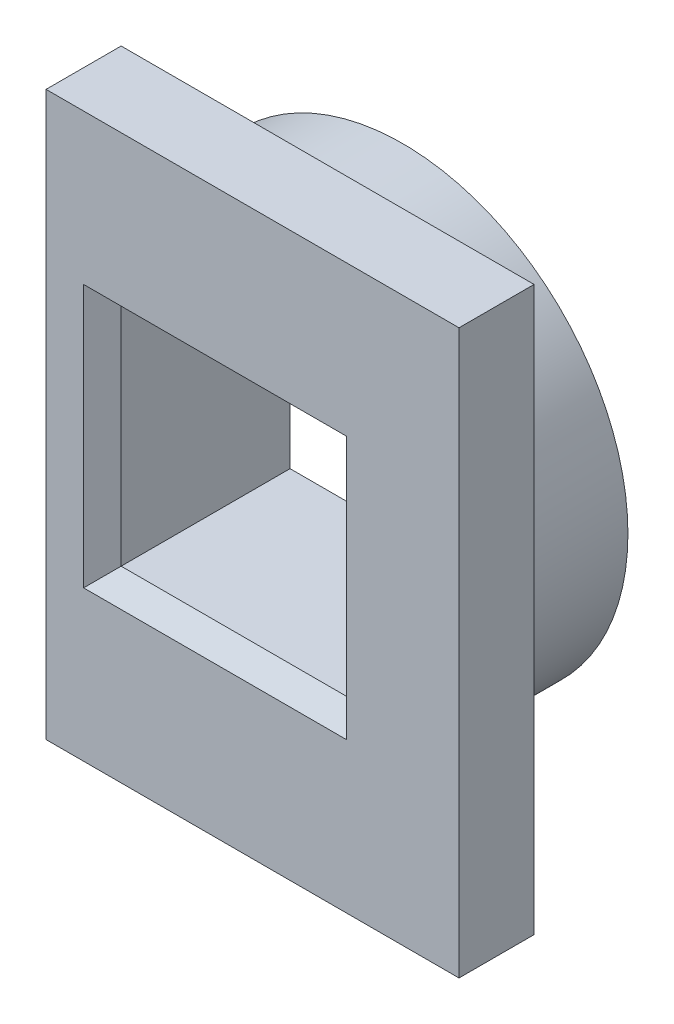
ISO-10303-21;
HEADER;
FILE_DESCRIPTION(('STEP AP214'),'2;1');
FILE_NAME('part.step','',(''),(''),'','','');
FILE_SCHEMA(('AUTOMOTIVE_DESIGN { 1 0 10303 214 1 1 1 1 }'));
ENDSEC;
DATA;
#1=APPLICATION_CONTEXT('core data for automotive mechanical design processes');
#2=APPLICATION_PROTOCOL_DEFINITION('international standard','automotive_design',2000,#1);
#3=PRODUCT_CONTEXT('',#1,'mechanical');
#4=PRODUCT('Part','Part','',(#3));
#5=PRODUCT_RELATED_PRODUCT_CATEGORY('part','',(#4));
#6=PRODUCT_DEFINITION_FORMATION('','',#4);
#7=PRODUCT_DEFINITION_CONTEXT('part definition',#1,'design');
#8=PRODUCT_DEFINITION('design','',#6,#7);
#9=PRODUCT_DEFINITION_SHAPE('','',#8);
#10=(LENGTH_UNIT() NAMED_UNIT(*) SI_UNIT(.MILLI.,.METRE.));
#11=(NAMED_UNIT(*) PLANE_ANGLE_UNIT() SI_UNIT($,.RADIAN.));
#12=(NAMED_UNIT(*) SI_UNIT($,.STERADIAN.) SOLID_ANGLE_UNIT());
#13=UNCERTAINTY_MEASURE_WITH_UNIT(LENGTH_MEASURE(1.E-05),#10,'distance_accuracy_value','');
#14=(GEOMETRIC_REPRESENTATION_CONTEXT(3) GLOBAL_UNCERTAINTY_ASSIGNED_CONTEXT((#13)) GLOBAL_UNIT_ASSIGNED_CONTEXT((#10,
#11,#12)) REPRESENTATION_CONTEXT('',''));
#15=CARTESIAN_POINT('',(0.,0.,0.));
#16=DIRECTION('',(0.,0.,1.));
#17=DIRECTION('',(1.,0.,0.));
#18=AXIS2_PLACEMENT_3D('',#15,#16,#17);
#19=CARTESIAN_POINT('',(0.,0.,3.));
#20=DIRECTION('',(0.,0.,-1.));
#21=DIRECTION('',(-1.,0.,0.));
#22=AXIS2_PLACEMENT_3D('',#19,#20,#21);
#23=CYLINDRICAL_SURFACE('',#22,6.);
#24=CARTESIAN_POINT('',(0.,0.,3.));
#25=DIRECTION('',(0.,0.,1.));
#26=DIRECTION('',(1.,0.,0.));
#27=AXIS2_PLACEMENT_3D('',#24,#25,#26);
#28=CIRCLE('',#27,6.);
#29=CARTESIAN_POINT('',(-4.5,3.96862696659689,3.));
#30=VERTEX_POINT('',#29);
#31=CARTESIAN_POINT('',(-4.5,-3.96862696659689,3.));
#32=VERTEX_POINT('',#31);
#33=EDGE_CURVE('E205',#30,#32,#28,.T.);
#34=ORIENTED_EDGE('',*,*,#33,.F.);
#35=EDGE_CURVE('E208',#32,#30,#28,.T.);
#36=ORIENTED_EDGE('',*,*,#35,.F.);
#37=EDGE_LOOP('',(#34,#36));
#38=FACE_BOUND('',#37,.T.);
#39=CARTESIAN_POINT('',(0.,0.,0.));
#40=DIRECTION('',(0.,0.,1.));
#41=DIRECTION('',(1.,0.,0.));
#42=AXIS2_PLACEMENT_3D('',#39,#40,#41);
#43=CIRCLE('',#42,6.);
#44=CARTESIAN_POINT('',(6.,0.,0.));
#45=VERTEX_POINT('',#44);
#46=EDGE_CURVE('E204',#45,#45,#43,.T.);
#47=ORIENTED_EDGE('',*,*,#46,.T.);
#48=EDGE_LOOP('',(#47));
#49=FACE_BOUND('',#48,.T.);
#50=ADVANCED_FACE('F41',(#38,#49),#23,.T.);
#51=CARTESIAN_POINT('',(0.,0.,3.));
#52=DIRECTION('',(0.,0.,1.));
#53=DIRECTION('',(1.,0.,0.));
#54=AXIS2_PLACEMENT_3D('',#51,#52,#53);
#55=PLANE('',#54);
#56=DIRECTION('',(0.,-1.,0.));
#57=VECTOR('',#56,1.);
#58=CARTESIAN_POINT('',(-4.5,7.5,3.));
#59=LINE('',#58,#57);
#60=EDGE_CURVE('E181',#30,#32,#59,.T.);
#61=ORIENTED_EDGE('',*,*,#60,.F.);
#62=ORIENTED_EDGE('',*,*,#33,.T.);
#63=EDGE_LOOP('',(#61,#62));
#64=FACE_BOUND('',#63,.T.);
#65=ADVANCED_FACE('F278',(#64),#55,.T.);
#66=CARTESIAN_POINT('',(0.,0.,0.));
#67=DIRECTION('',(0.,0.,1.));
#68=DIRECTION('',(1.,0.,0.));
#69=AXIS2_PLACEMENT_3D('',#66,#67,#68);
#70=PLANE('',#69);
#71=DIRECTION('',(-1.,0.,0.));
#72=VECTOR('',#71,1.);
#73=CARTESIAN_POINT('',(3.,-3.,0.));
#74=LINE('',#73,#72);
#75=CARTESIAN_POINT('',(3.,-3.,0.));
#76=VERTEX_POINT('',#75);
#77=CARTESIAN_POINT('',(-3.,-3.,0.));
#78=VERTEX_POINT('',#77);
#79=EDGE_CURVE('E135',#76,#78,#74,.T.);
#80=ORIENTED_EDGE('',*,*,#79,.F.);
#81=DIRECTION('',(0.,-1.,0.));
#82=VECTOR('',#81,1.);
#83=CARTESIAN_POINT('',(3.,3.,0.));
#84=LINE('',#83,#82);
#85=CARTESIAN_POINT('',(3.,3.,0.));
#86=VERTEX_POINT('',#85);
#87=EDGE_CURVE('E141',#86,#76,#84,.T.);
#88=ORIENTED_EDGE('',*,*,#87,.F.);
#89=DIRECTION('',(1.,0.,0.));
#90=VECTOR('',#89,1.);
#91=CARTESIAN_POINT('',(3.,3.,0.));
#92=LINE('',#91,#90);
#93=CARTESIAN_POINT('',(-3.,3.,0.));
#94=VERTEX_POINT('',#93);
#95=EDGE_CURVE('E146',#94,#86,#92,.T.);
#96=ORIENTED_EDGE('',*,*,#95,.F.);
#97=DIRECTION('',(0.,1.,0.));
#98=VECTOR('',#97,1.);
#99=CARTESIAN_POINT('',(-3.,3.,0.));
#100=LINE('',#99,#98);
#101=EDGE_CURVE('E128',#78,#94,#100,.T.);
#102=ORIENTED_EDGE('',*,*,#101,.F.);
#103=EDGE_LOOP('',(#80,#88,#96,#102));
#104=FACE_BOUND('',#103,.T.);
#105=ORIENTED_EDGE('',*,*,#46,.F.);
#106=EDGE_LOOP('',(#105));
#107=FACE_BOUND('',#106,.T.);
#108=ADVANCED_FACE('F143',(#104,#107),#70,.F.);
#109=CARTESIAN_POINT('',(0.,0.,3.));
#110=DIRECTION('',(0.,0.,1.));
#111=DIRECTION('',(1.,0.,0.));
#112=AXIS2_PLACEMENT_3D('',#109,#110,#111);
#113=PLANE('',#112);
#114=CARTESIAN_POINT('',(-4.5,-7.5,3.));
#115=VERTEX_POINT('',#114);
#116=EDGE_CURVE('E156',#32,#115,#59,.T.);
#117=ORIENTED_EDGE('',*,*,#116,.F.);
#118=ORIENTED_EDGE('',*,*,#35,.T.);
#119=CARTESIAN_POINT('',(-4.5,7.5,3.));
#120=VERTEX_POINT('',#119);
#121=EDGE_CURVE('E176',#120,#30,#59,.T.);
#122=ORIENTED_EDGE('',*,*,#121,.F.);
#123=DIRECTION('',(-1.,0.,0.));
#124=VECTOR('',#123,1.);
#125=CARTESIAN_POINT('',(-4.5,7.5,3.));
#126=LINE('',#125,#124);
#127=CARTESIAN_POINT('',(6.5,7.5,3.));
#128=VERTEX_POINT('',#127);
#129=EDGE_CURVE('E166',#128,#120,#126,.T.);
#130=ORIENTED_EDGE('',*,*,#129,.F.);
#131=DIRECTION('',(0.,1.,0.));
#132=VECTOR('',#131,1.);
#133=CARTESIAN_POINT('',(6.5,7.5,3.));
#134=LINE('',#133,#132);
#135=CARTESIAN_POINT('',(6.5,-7.5,3.));
#136=VERTEX_POINT('',#135);
#137=EDGE_CURVE('E184',#136,#128,#134,.T.);
#138=ORIENTED_EDGE('',*,*,#137,.F.);
#139=DIRECTION('',(1.,0.,0.));
#140=VECTOR('',#139,1.);
#141=CARTESIAN_POINT('',(-4.5,-7.5,3.));
#142=LINE('',#141,#140);
#143=EDGE_CURVE('E180',#115,#136,#142,.T.);
#144=ORIENTED_EDGE('',*,*,#143,.F.);
#145=EDGE_LOOP('',(#117,#118,#122,#130,#138,#144));
#146=FACE_BOUND('',#145,.T.);
#147=ADVANCED_FACE('F369',(#146),#113,.F.);
#148=CARTESIAN_POINT('',(-4.5,7.5,5.));
#149=DIRECTION('',(1.,0.,0.));
#150=DIRECTION('',(0.,1.,0.));
#151=AXIS2_PLACEMENT_3D('',#148,#149,#150);
#152=PLANE('',#151);
#153=ORIENTED_EDGE('',*,*,#121,.T.);
#154=ORIENTED_EDGE('',*,*,#60,.T.);
#155=ORIENTED_EDGE('',*,*,#116,.T.);
#156=DIRECTION('',(0.,0.,-1.));
#157=VECTOR('',#156,1.);
#158=CARTESIAN_POINT('',(-4.5,-7.5,5.));
#159=LINE('',#158,#157);
#160=CARTESIAN_POINT('',(-4.5,-7.5,5.));
#161=VERTEX_POINT('',#160);
#162=EDGE_CURVE('E200',#161,#115,#159,.T.);
#163=ORIENTED_EDGE('',*,*,#162,.F.);
#164=DIRECTION('',(0.,-1.,0.));
#165=VECTOR('',#164,1.);
#166=CARTESIAN_POINT('',(-4.5,7.5,5.));
#167=LINE('',#166,#165);
#168=CARTESIAN_POINT('',(-4.5,7.5,5.));
#169=VERTEX_POINT('',#168);
#170=EDGE_CURVE('E161',#169,#161,#167,.T.);
#171=ORIENTED_EDGE('',*,*,#170,.F.);
#172=DIRECTION('',(0.,0.,-1.));
#173=VECTOR('',#172,1.);
#174=CARTESIAN_POINT('',(-4.5,7.5,5.));
#175=LINE('',#174,#173);
#176=EDGE_CURVE('E175',#169,#120,#175,.T.);
#177=ORIENTED_EDGE('',*,*,#176,.T.);
#178=EDGE_LOOP('',(#153,#154,#155,#163,#171,#177));
#179=FACE_BOUND('',#178,.T.);
#180=ADVANCED_FACE('F398',(#179),#152,.F.);
#181=CARTESIAN_POINT('',(-4.5,-7.5,5.));
#182=DIRECTION('',(0.,1.,0.));
#183=DIRECTION('',(0.,0.,1.));
#184=AXIS2_PLACEMENT_3D('',#181,#182,#183);
#185=PLANE('',#184);
#186=ORIENTED_EDGE('',*,*,#143,.T.);
#187=DIRECTION('',(0.,0.,-1.));
#188=VECTOR('',#187,1.);
#189=CARTESIAN_POINT('',(6.5,-7.5,5.));
#190=LINE('',#189,#188);
#191=CARTESIAN_POINT('',(6.5,-7.5,5.));
#192=VERTEX_POINT('',#191);
#193=EDGE_CURVE('E196',#192,#136,#190,.T.);
#194=ORIENTED_EDGE('',*,*,#193,.F.);
#195=DIRECTION('',(1.,0.,0.));
#196=VECTOR('',#195,1.);
#197=CARTESIAN_POINT('',(-4.5,-7.5,5.));
#198=LINE('',#197,#196);
#199=EDGE_CURVE('E165',#161,#192,#198,.T.);
#200=ORIENTED_EDGE('',*,*,#199,.F.);
#201=ORIENTED_EDGE('',*,*,#162,.T.);
#202=EDGE_LOOP('',(#186,#194,#200,#201));
#203=FACE_BOUND('',#202,.T.);
#204=ADVANCED_FACE('F388',(#203),#185,.F.);
#205=CARTESIAN_POINT('',(6.5,7.5,5.));
#206=DIRECTION('',(-1.,0.,0.));
#207=DIRECTION('',(0.,0.,1.));
#208=AXIS2_PLACEMENT_3D('',#205,#206,#207);
#209=PLANE('',#208);
#210=ORIENTED_EDGE('',*,*,#137,.T.);
#211=DIRECTION('',(0.,0.,-1.));
#212=VECTOR('',#211,1.);
#213=CARTESIAN_POINT('',(6.5,7.5,5.));
#214=LINE('',#213,#212);
#215=CARTESIAN_POINT('',(6.5,7.5,5.));
#216=VERTEX_POINT('',#215);
#217=EDGE_CURVE('E192',#216,#128,#214,.T.);
#218=ORIENTED_EDGE('',*,*,#217,.F.);
#219=DIRECTION('',(0.,1.,0.));
#220=VECTOR('',#219,1.);
#221=CARTESIAN_POINT('',(6.5,7.5,5.));
#222=LINE('',#221,#220);
#223=EDGE_CURVE('E169',#192,#216,#222,.T.);
#224=ORIENTED_EDGE('',*,*,#223,.F.);
#225=ORIENTED_EDGE('',*,*,#193,.T.);
#226=EDGE_LOOP('',(#210,#218,#224,#225));
#227=FACE_BOUND('',#226,.T.);
#228=ADVANCED_FACE('F378',(#227),#209,.F.);
#229=CARTESIAN_POINT('',(-4.5,7.5,5.));
#230=DIRECTION('',(0.,-1.,0.));
#231=DIRECTION('',(1.,0.,0.));
#232=AXIS2_PLACEMENT_3D('',#229,#230,#231);
#233=PLANE('',#232);
#234=ORIENTED_EDGE('',*,*,#129,.T.);
#235=ORIENTED_EDGE('',*,*,#176,.F.);
#236=DIRECTION('',(-1.,0.,0.));
#237=VECTOR('',#236,1.);
#238=CARTESIAN_POINT('',(-4.5,7.5,5.));
#239=LINE('',#238,#237);
#240=EDGE_CURVE('E172',#216,#169,#239,.T.);
#241=ORIENTED_EDGE('',*,*,#240,.F.);
#242=ORIENTED_EDGE('',*,*,#217,.T.);
#243=EDGE_LOOP('',(#234,#235,#241,#242));
#244=FACE_BOUND('',#243,.T.);
#245=ADVANCED_FACE('F358',(#244),#233,.F.);
#246=CARTESIAN_POINT('',(0.,0.,5.));
#247=DIRECTION('',(0.,0.,1.));
#248=DIRECTION('',(1.,0.,0.));
#249=AXIS2_PLACEMENT_3D('',#246,#247,#248);
#250=PLANE('',#249);
#251=DIRECTION('',(0.,1.,0.));
#252=VECTOR('',#251,1.);
#253=CARTESIAN_POINT('',(-3.5,3.,5.));
#254=LINE('',#253,#252);
#255=CARTESIAN_POINT('',(-3.5,-3.5,5.));
#256=VERTEX_POINT('',#255);
#257=CARTESIAN_POINT('',(-3.5,3.5,5.));
#258=VERTEX_POINT('',#257);
#259=EDGE_CURVE('E212',#256,#258,#254,.T.);
#260=ORIENTED_EDGE('',*,*,#259,.T.);
#261=DIRECTION('',(1.,0.,0.));
#262=VECTOR('',#261,1.);
#263=CARTESIAN_POINT('',(3.,3.5,5.));
#264=LINE('',#263,#262);
#265=CARTESIAN_POINT('',(3.5,3.5,5.));
#266=VERTEX_POINT('',#265);
#267=EDGE_CURVE('E221',#258,#266,#264,.T.);
#268=ORIENTED_EDGE('',*,*,#267,.T.);
#269=DIRECTION('',(0.,-1.,0.));
#270=VECTOR('',#269,1.);
#271=CARTESIAN_POINT('',(3.5,-3.,5.));
#272=LINE('',#271,#270);
#273=CARTESIAN_POINT('',(3.5,-3.5,5.));
#274=VERTEX_POINT('',#273);
#275=EDGE_CURVE('E218',#266,#274,#272,.T.);
#276=ORIENTED_EDGE('',*,*,#275,.T.);
#277=DIRECTION('',(-1.,0.,0.));
#278=VECTOR('',#277,1.);
#279=CARTESIAN_POINT('',(-3.,-3.5,5.));
#280=LINE('',#279,#278);
#281=EDGE_CURVE('E215',#274,#256,#280,.T.);
#282=ORIENTED_EDGE('',*,*,#281,.T.);
#283=EDGE_LOOP('',(#260,#268,#276,#282));
#284=FACE_BOUND('',#283,.T.);
#285=ORIENTED_EDGE('',*,*,#170,.T.);
#286=ORIENTED_EDGE('',*,*,#199,.T.);
#287=ORIENTED_EDGE('',*,*,#223,.T.);
#288=ORIENTED_EDGE('',*,*,#240,.T.);
#289=EDGE_LOOP('',(#285,#286,#287,#288));
#290=FACE_BOUND('',#289,.T.);
#291=ADVANCED_FACE('F266',(#284,#290),#250,.T.);
#292=CARTESIAN_POINT('',(3.,3.,5.));
#293=DIRECTION('',(1.,0.,0.));
#294=DIRECTION('',(0.,1.,0.));
#295=AXIS2_PLACEMENT_3D('',#292,#293,#294);
#296=PLANE('',#295);
#297=DIRECTION('',(0.,0.,-1.));
#298=VECTOR('',#297,1.);
#299=CARTESIAN_POINT('',(3.,-3.,5.));
#300=LINE('',#299,#298);
#301=CARTESIAN_POINT('',(3.,-3.,4.5));
#302=VERTEX_POINT('',#301);
#303=EDGE_CURVE('E132',#302,#76,#300,.T.);
#304=ORIENTED_EDGE('',*,*,#303,.F.);
#305=DIRECTION('',(0.,1.,0.));
#306=VECTOR('',#305,1.);
#307=CARTESIAN_POINT('',(3.,3.,4.5));
#308=LINE('',#307,#306);
#309=CARTESIAN_POINT('',(3.,3.,4.5));
#310=VERTEX_POINT('',#309);
#311=EDGE_CURVE('E229',#302,#310,#308,.T.);
#312=ORIENTED_EDGE('',*,*,#311,.T.);
#313=DIRECTION('',(0.,0.,-1.));
#314=VECTOR('',#313,1.);
#315=CARTESIAN_POINT('',(3.,3.,5.));
#316=LINE('',#315,#314);
#317=EDGE_CURVE('E153',#310,#86,#316,.T.);
#318=ORIENTED_EDGE('',*,*,#317,.T.);
#319=ORIENTED_EDGE('',*,*,#87,.T.);
#320=EDGE_LOOP('',(#304,#312,#318,#319));
#321=FACE_BOUND('',#320,.T.);
#322=ADVANCED_FACE('F253',(#321),#296,.F.);
#323=CARTESIAN_POINT('',(3.,3.,5.));
#324=DIRECTION('',(0.,1.,0.));
#325=DIRECTION('',(-1.,0.,0.));
#326=AXIS2_PLACEMENT_3D('',#323,#324,#325);
#327=PLANE('',#326);
#328=ORIENTED_EDGE('',*,*,#317,.F.);
#329=DIRECTION('',(-1.,0.,0.));
#330=VECTOR('',#329,1.);
#331=CARTESIAN_POINT('',(-3.,3.,4.5));
#332=LINE('',#331,#330);
#333=CARTESIAN_POINT('',(-3.,3.,4.5));
#334=VERTEX_POINT('',#333);
#335=EDGE_CURVE('E225',#310,#334,#332,.T.);
#336=ORIENTED_EDGE('',*,*,#335,.T.);
#337=DIRECTION('',(0.,0.,-1.));
#338=VECTOR('',#337,1.);
#339=CARTESIAN_POINT('',(-3.,3.,5.));
#340=LINE('',#339,#338);
#341=EDGE_CURVE('E131',#334,#94,#340,.T.);
#342=ORIENTED_EDGE('',*,*,#341,.T.);
#343=ORIENTED_EDGE('',*,*,#95,.T.);
#344=EDGE_LOOP('',(#328,#336,#342,#343));
#345=FACE_BOUND('',#344,.T.);
#346=ADVANCED_FACE('F257',(#345),#327,.F.);
#347=CARTESIAN_POINT('',(-3.,3.,5.));
#348=DIRECTION('',(-1.,0.,0.));
#349=DIRECTION('',(0.,0.,1.));
#350=AXIS2_PLACEMENT_3D('',#347,#348,#349);
#351=PLANE('',#350);
#352=ORIENTED_EDGE('',*,*,#341,.F.);
#353=DIRECTION('',(0.,-1.,0.));
#354=VECTOR('',#353,1.);
#355=CARTESIAN_POINT('',(-3.,-3.,4.5));
#356=LINE('',#355,#354);
#357=CARTESIAN_POINT('',(-3.,-3.,4.5));
#358=VERTEX_POINT('',#357);
#359=EDGE_CURVE('E11',#334,#358,#356,.T.);
#360=ORIENTED_EDGE('',*,*,#359,.T.);
#361=DIRECTION('',(0.,0.,-1.));
#362=VECTOR('',#361,1.);
#363=CARTESIAN_POINT('',(-3.,-3.,5.));
#364=LINE('',#363,#362);
#365=EDGE_CURVE('E124',#358,#78,#364,.T.);
#366=ORIENTED_EDGE('',*,*,#365,.T.);
#367=ORIENTED_EDGE('',*,*,#101,.T.);
#368=EDGE_LOOP('',(#352,#360,#366,#367));
#369=FACE_BOUND('',#368,.T.);
#370=ADVANCED_FACE('F126',(#369),#351,.F.);
#371=CARTESIAN_POINT('',(3.,-3.,5.));
#372=DIRECTION('',(0.,-1.,0.));
#373=DIRECTION('',(1.,0.,0.));
#374=AXIS2_PLACEMENT_3D('',#371,#372,#373);
#375=PLANE('',#374);
#376=ORIENTED_EDGE('',*,*,#365,.F.);
#377=DIRECTION('',(1.,0.,0.));
#378=VECTOR('',#377,1.);
#379=CARTESIAN_POINT('',(3.,-3.,4.5));
#380=LINE('',#379,#378);
#381=EDGE_CURVE('E52',#358,#302,#380,.T.);
#382=ORIENTED_EDGE('',*,*,#381,.T.);
#383=ORIENTED_EDGE('',*,*,#303,.T.);
#384=ORIENTED_EDGE('',*,*,#79,.T.);
#385=EDGE_LOOP('',(#376,#382,#383,#384));
#386=FACE_BOUND('',#385,.T.);
#387=ADVANCED_FACE('F136',(#386),#375,.F.);
#388=CARTESIAN_POINT('',(0.,-3.5,5.));
#389=DIRECTION('',(0.,0.70710678118655,0.707106781186545));
#390=DIRECTION('',(1.,0.,0.));
#391=AXIS2_PLACEMENT_3D('',#388,#389,#390);
#392=PLANE('',#391);
#393=DIRECTION('',(-0.577350269189624,0.577350269189624,-0.577350269189629));
#394=VECTOR('',#393,1.);
#395=CARTESIAN_POINT('',(2.33333333333334,-2.33333333333334,3.83333333333333));
#396=LINE('',#395,#394);
#397=EDGE_CURVE('E239',#302,#274,#396,.F.);
#398=ORIENTED_EDGE('',*,*,#397,.F.);
#399=ORIENTED_EDGE('',*,*,#381,.F.);
#400=DIRECTION('',(0.577350269189624,0.577350269189624,-0.577350269189628));
#401=VECTOR('',#400,1.);
#402=CARTESIAN_POINT('',(-2.33333333333334,-2.33333333333334,3.83333333333333));
#403=LINE('',#402,#401);
#404=EDGE_CURVE('E46',#256,#358,#403,.T.);
#405=ORIENTED_EDGE('',*,*,#404,.F.);
#406=ORIENTED_EDGE('',*,*,#281,.F.);
#407=EDGE_LOOP('',(#398,#399,#405,#406));
#408=FACE_BOUND('',#407,.T.);
#409=ADVANCED_FACE('F44',(#408),#392,.T.);
#410=CARTESIAN_POINT('',(-3.5,0.,5.));
#411=DIRECTION('',(0.70710678118655,0.,0.707106781186545));
#412=DIRECTION('',(0.,-1.,0.));
#413=AXIS2_PLACEMENT_3D('',#410,#411,#412);
#414=PLANE('',#413);
#415=ORIENTED_EDGE('',*,*,#404,.T.);
#416=ORIENTED_EDGE('',*,*,#359,.F.);
#417=DIRECTION('',(-0.577350269189624,0.577350269189624,0.577350269189628));
#418=VECTOR('',#417,1.);
#419=CARTESIAN_POINT('',(-2.33333333333334,2.33333333333334,3.83333333333333));
#420=LINE('',#419,#418);
#421=EDGE_CURVE('E237',#258,#334,#420,.F.);
#422=ORIENTED_EDGE('',*,*,#421,.F.);
#423=ORIENTED_EDGE('',*,*,#259,.F.);
#424=EDGE_LOOP('',(#415,#416,#422,#423));
#425=FACE_BOUND('',#424,.T.);
#426=ADVANCED_FACE('F268',(#425),#414,.T.);
#427=CARTESIAN_POINT('',(3.5,0.,5.));
#428=DIRECTION('',(-0.70710678118655,0.,0.707106781186545));
#429=DIRECTION('',(0.,1.,0.));
#430=AXIS2_PLACEMENT_3D('',#427,#428,#429);
#431=PLANE('',#430);
#432=ORIENTED_EDGE('',*,*,#397,.T.);
#433=ORIENTED_EDGE('',*,*,#275,.F.);
#434=DIRECTION('',(-0.577350269189624,-0.577350269189624,-0.577350269189629));
#435=VECTOR('',#434,1.);
#436=CARTESIAN_POINT('',(2.33333333333334,2.33333333333334,3.83333333333333));
#437=LINE('',#436,#435);
#438=EDGE_CURVE('E234',#310,#266,#437,.F.);
#439=ORIENTED_EDGE('',*,*,#438,.F.);
#440=ORIENTED_EDGE('',*,*,#311,.F.);
#441=EDGE_LOOP('',(#432,#433,#439,#440));
#442=FACE_BOUND('',#441,.T.);
#443=ADVANCED_FACE('F263',(#442),#431,.T.);
#444=CARTESIAN_POINT('',(0.,3.5,5.));
#445=DIRECTION('',(0.,-0.70710678118655,0.707106781186545));
#446=DIRECTION('',(-1.,0.,0.));
#447=AXIS2_PLACEMENT_3D('',#444,#445,#446);
#448=PLANE('',#447);
#449=ORIENTED_EDGE('',*,*,#421,.T.);
#450=ORIENTED_EDGE('',*,*,#335,.F.);
#451=ORIENTED_EDGE('',*,*,#438,.T.);
#452=ORIENTED_EDGE('',*,*,#267,.F.);
#453=EDGE_LOOP('',(#449,#450,#451,#452));
#454=FACE_BOUND('',#453,.T.);
#455=ADVANCED_FACE('F260',(#454),#448,.T.);
#456=CLOSED_SHELL('',(#50,#65,#108,#147,#180,#204,#228,#245,#291,#322,#346,#370,#387,#409,#426,
#443,#455));
#457=MANIFOLD_SOLID_BREP('B2',#456);
#458=ADVANCED_BREP_SHAPE_REPRESENTATION('',(#18,#457),#14);
#459=SHAPE_DEFINITION_REPRESENTATION(#9,#458);
ENDSEC;
END-ISO-10303-21;
